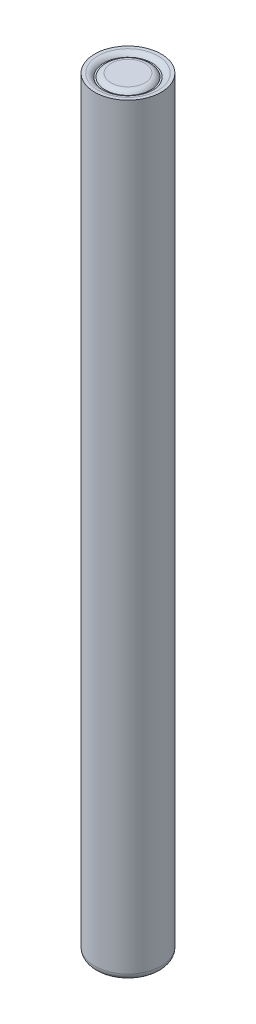
ISO-10303-21;
HEADER;
FILE_DESCRIPTION(('STEP AP214'),'2;1');
FILE_NAME('part.step','',(''),(''),'','','');
FILE_SCHEMA(('AUTOMOTIVE_DESIGN { 1 0 10303 214 1 1 1 1 }'));
ENDSEC;
DATA;
#1=APPLICATION_CONTEXT('core data for automotive mechanical design processes');
#2=APPLICATION_PROTOCOL_DEFINITION('international standard','automotive_design',2000,#1);
#3=PRODUCT_CONTEXT('',#1,'mechanical');
#4=PRODUCT('Part','Part','',(#3));
#5=PRODUCT_RELATED_PRODUCT_CATEGORY('part','',(#4));
#6=PRODUCT_DEFINITION_FORMATION('','',#4);
#7=PRODUCT_DEFINITION_CONTEXT('part definition',#1,'design');
#8=PRODUCT_DEFINITION('design','',#6,#7);
#9=PRODUCT_DEFINITION_SHAPE('','',#8);
#10=(LENGTH_UNIT() NAMED_UNIT(*) SI_UNIT(.MILLI.,.METRE.));
#11=(NAMED_UNIT(*) PLANE_ANGLE_UNIT() SI_UNIT($,.RADIAN.));
#12=(NAMED_UNIT(*) SI_UNIT($,.STERADIAN.) SOLID_ANGLE_UNIT());
#13=UNCERTAINTY_MEASURE_WITH_UNIT(LENGTH_MEASURE(1.E-05),#10,'distance_accuracy_value','');
#14=(GEOMETRIC_REPRESENTATION_CONTEXT(3) GLOBAL_UNCERTAINTY_ASSIGNED_CONTEXT((#13)) GLOBAL_UNIT_ASSIGNED_CONTEXT((#10,
#11,#12)) REPRESENTATION_CONTEXT('',''));
#15=CARTESIAN_POINT('',(0.,0.,0.));
#16=DIRECTION('',(0.,0.,1.));
#17=DIRECTION('',(1.,0.,0.));
#18=AXIS2_PLACEMENT_3D('',#15,#16,#17);
#19=CARTESIAN_POINT('',(0.,115.,0.));
#20=DIRECTION('',(0.,-1.,0.));
#21=DIRECTION('',(0.,0.,-1.));
#22=AXIS2_PLACEMENT_3D('',#19,#20,#21);
#23=CYLINDRICAL_SURFACE('',#22,5.);
#24=CARTESIAN_POINT('',(0.,1.,0.));
#25=DIRECTION('',(0.,1.,0.));
#26=DIRECTION('',(0.,0.,1.));
#27=AXIS2_PLACEMENT_3D('',#24,#25,#26);
#28=CIRCLE('',#27,5.);
#29=CARTESIAN_POINT('',(0.,1.,5.));
#30=VERTEX_POINT('',#29);
#31=EDGE_CURVE('E53',#30,#30,#28,.T.);
#32=ORIENTED_EDGE('',*,*,#31,.T.);
#33=EDGE_LOOP('',(#32));
#34=FACE_BOUND('',#33,.T.);
#35=CARTESIAN_POINT('',(0.,115.,0.));
#36=DIRECTION('',(0.,1.,0.));
#37=DIRECTION('',(0.,0.,1.));
#38=AXIS2_PLACEMENT_3D('',#35,#36,#37);
#39=CIRCLE('',#38,5.);
#40=CARTESIAN_POINT('',(0.,115.,5.));
#41=VERTEX_POINT('',#40);
#42=EDGE_CURVE('E65',#41,#41,#39,.T.);
#43=ORIENTED_EDGE('',*,*,#42,.F.);
#44=EDGE_LOOP('',(#43));
#45=FACE_BOUND('',#44,.T.);
#46=ADVANCED_FACE('F30',(#34,#45),#23,.T.);
#47=CARTESIAN_POINT('',(0.,115.,0.));
#48=DIRECTION('',(0.,1.,0.));
#49=DIRECTION('',(0.,0.,1.));
#50=AXIS2_PLACEMENT_3D('',#47,#48,#49);
#51=PLANE('',#50);
#52=CARTESIAN_POINT('',(0.,115.,0.));
#53=DIRECTION('',(0.,1.,0.));
#54=DIRECTION('',(0.,0.,1.));
#55=AXIS2_PLACEMENT_3D('',#52,#53,#54);
#56=CIRCLE('',#55,4.50328475365712);
#57=CARTESIAN_POINT('',(0.,115.,4.50328475365712));
#58=VERTEX_POINT('',#57);
#59=EDGE_CURVE('E59',#58,#58,#56,.F.);
#60=ORIENTED_EDGE('',*,*,#59,.T.);
#61=EDGE_LOOP('',(#60));
#62=FACE_BOUND('',#61,.T.);
#63=ORIENTED_EDGE('',*,*,#42,.T.);
#64=EDGE_LOOP('',(#63));
#65=FACE_BOUND('',#64,.T.);
#66=ADVANCED_FACE('F101',(#62,#65),#51,.T.);
#67=CARTESIAN_POINT('',(0.,0.,0.));
#68=DIRECTION('',(0.,1.,0.));
#69=DIRECTION('',(0.,0.,1.));
#70=AXIS2_PLACEMENT_3D('',#67,#68,#69);
#71=PLANE('',#70);
#72=CARTESIAN_POINT('',(0.,0.,0.));
#73=DIRECTION('',(0.,1.,0.));
#74=DIRECTION('',(0.,0.,1.));
#75=AXIS2_PLACEMENT_3D('',#72,#73,#74);
#76=CIRCLE('',#75,4.);
#77=CARTESIAN_POINT('',(0.,0.,4.));
#78=VERTEX_POINT('',#77);
#79=EDGE_CURVE('E50',#78,#78,#76,.F.);
#80=ORIENTED_EDGE('',*,*,#79,.T.);
#81=EDGE_LOOP('',(#80));
#82=FACE_BOUND('',#81,.T.);
#83=CARTESIAN_POINT('',(0.,0.,0.));
#84=DIRECTION('',(0.,1.,0.));
#85=DIRECTION('',(0.,0.,1.));
#86=AXIS2_PLACEMENT_3D('',#83,#84,#85);
#87=CIRCLE('',#86,1.5);
#88=CARTESIAN_POINT('',(0.,0.,1.5));
#89=VERTEX_POINT('',#88);
#90=EDGE_CURVE('E62',#89,#89,#87,.F.);
#91=ORIENTED_EDGE('',*,*,#90,.F.);
#92=EDGE_LOOP('',(#91));
#93=FACE_BOUND('',#92,.T.);
#94=ADVANCED_FACE('F109',(#82,#93),#71,.F.);
#95=CARTESIAN_POINT('',(0.,-1.,0.));
#96=DIRECTION('',(0.,1.,0.));
#97=DIRECTION('',(0.,0.,1.));
#98=AXIS2_PLACEMENT_3D('',#95,#96,#97);
#99=CYLINDRICAL_SURFACE('',#98,1.5);
#100=CARTESIAN_POINT('',(0.,-0.45,0.));
#101=DIRECTION('',(0.,-1.,0.));
#102=DIRECTION('',(0.,0.,-1.));
#103=AXIS2_PLACEMENT_3D('',#100,#101,#102);
#104=CIRCLE('',#103,1.5);
#105=CARTESIAN_POINT('',(0.,-0.45,-1.5));
#106=VERTEX_POINT('',#105);
#107=EDGE_CURVE('E41',#106,#106,#104,.F.);
#108=ORIENTED_EDGE('',*,*,#107,.T.);
#109=EDGE_LOOP('',(#108));
#110=FACE_BOUND('',#109,.T.);
#111=ORIENTED_EDGE('',*,*,#90,.T.);
#112=EDGE_LOOP('',(#111));
#113=FACE_BOUND('',#112,.T.);
#114=ADVANCED_FACE('F114',(#110,#113),#99,.T.);
#115=CARTESIAN_POINT('',(0.,-1.,0.));
#116=DIRECTION('',(0.,-1.,0.));
#117=DIRECTION('',(0.,0.,-1.));
#118=AXIS2_PLACEMENT_3D('',#115,#116,#117);
#119=PLANE('',#118);
#120=CARTESIAN_POINT('',(0.,-1.,0.));
#121=DIRECTION('',(0.,-1.,0.));
#122=DIRECTION('',(0.,0.,-1.));
#123=AXIS2_PLACEMENT_3D('',#120,#121,#122);
#124=CIRCLE('',#123,0.95);
#125=CARTESIAN_POINT('',(0.,-1.,-0.95));
#126=VERTEX_POINT('',#125);
#127=EDGE_CURVE('E45',#126,#126,#124,.T.);
#128=ORIENTED_EDGE('',*,*,#127,.T.);
#129=EDGE_LOOP('',(#128));
#130=FACE_BOUND('',#129,.T.);
#131=CARTESIAN_POINT('',(0.,-1.,0.));
#132=DIRECTION('',(0.,-1.,0.));
#133=DIRECTION('',(0.,0.,-1.));
#134=AXIS2_PLACEMENT_3D('',#131,#132,#133);
#135=CIRCLE('',#134,0.5);
#136=CARTESIAN_POINT('',(0.,-1.,-0.5));
#137=VERTEX_POINT('',#136);
#138=EDGE_CURVE('E68',#137,#137,#135,.T.);
#139=ORIENTED_EDGE('',*,*,#138,.F.);
#140=EDGE_LOOP('',(#139));
#141=FACE_BOUND('',#140,.T.);
#142=ADVANCED_FACE('F119',(#130,#141),#119,.T.);
#143=CARTESIAN_POINT('',(0.,-1.5,0.));
#144=DIRECTION('',(0.,1.,0.));
#145=DIRECTION('',(0.,0.,1.));
#146=AXIS2_PLACEMENT_3D('',#143,#144,#145);
#147=CYLINDRICAL_SURFACE('',#146,0.5);
#148=CARTESIAN_POINT('',(0.,-1.4,0.));
#149=DIRECTION('',(0.,-1.,0.));
#150=DIRECTION('',(0.,0.,-1.));
#151=AXIS2_PLACEMENT_3D('',#148,#149,#150);
#152=CIRCLE('',#151,0.5);
#153=CARTESIAN_POINT('',(0.,-1.4,-0.5));
#154=VERTEX_POINT('',#153);
#155=EDGE_CURVE('E10',#154,#154,#152,.F.);
#156=ORIENTED_EDGE('',*,*,#155,.T.);
#157=EDGE_LOOP('',(#156));
#158=FACE_BOUND('',#157,.T.);
#159=ORIENTED_EDGE('',*,*,#138,.T.);
#160=EDGE_LOOP('',(#159));
#161=FACE_BOUND('',#160,.T.);
#162=ADVANCED_FACE('F123',(#158,#161),#147,.T.);
#163=CARTESIAN_POINT('',(0.,-1.5,0.));
#164=DIRECTION('',(0.,-1.,0.));
#165=DIRECTION('',(0.,0.,-1.));
#166=AXIS2_PLACEMENT_3D('',#163,#164,#165);
#167=PLANE('',#166);
#168=CARTESIAN_POINT('',(0.,-1.5,0.));
#169=DIRECTION('',(0.,-1.,0.));
#170=DIRECTION('',(0.,0.,-1.));
#171=AXIS2_PLACEMENT_3D('',#168,#169,#170);
#172=CIRCLE('',#171,0.4);
#173=CARTESIAN_POINT('',(0.,-1.5,-0.4));
#174=VERTEX_POINT('',#173);
#175=EDGE_CURVE('E37',#174,#174,#172,.T.);
#176=ORIENTED_EDGE('',*,*,#175,.T.);
#177=EDGE_LOOP('',(#176));
#178=FACE_BOUND('',#177,.T.);
#179=ADVANCED_FACE('F85',(#178),#167,.T.);
#180=CARTESIAN_POINT('',(0.,114.5,0.));
#181=DIRECTION('',(0.,1.,0.));
#182=DIRECTION('',(0.,0.,1.));
#183=AXIS2_PLACEMENT_3D('',#180,#181,#182);
#184=PLANE('',#183);
#185=CARTESIAN_POINT('',(0.,114.5,0.));
#186=DIRECTION('',(0.,1.,0.));
#187=DIRECTION('',(0.,0.,1.));
#188=AXIS2_PLACEMENT_3D('',#185,#186,#187);
#189=CIRCLE('',#188,3.41192903444036);
#190=CARTESIAN_POINT('',(0.,114.5,3.41192903444036));
#191=VERTEX_POINT('',#190);
#192=EDGE_CURVE('E74',#191,#191,#189,.T.);
#193=ORIENTED_EDGE('',*,*,#192,.F.);
#194=EDGE_LOOP('',(#193));
#195=FACE_BOUND('',#194,.T.);
#196=CARTESIAN_POINT('',(0.,114.5,0.));
#197=DIRECTION('',(0.,1.,0.));
#198=DIRECTION('',(0.,0.,1.));
#199=AXIS2_PLACEMENT_3D('',#196,#197,#198);
#200=CIRCLE('',#199,3.63725934987268);
#201=CARTESIAN_POINT('',(0.,114.5,3.63725934987268));
#202=VERTEX_POINT('',#201);
#203=EDGE_CURVE('E71',#202,#202,#200,.T.);
#204=ORIENTED_EDGE('',*,*,#203,.T.);
#205=EDGE_LOOP('',(#204));
#206=FACE_BOUND('',#205,.T.);
#207=ADVANCED_FACE('F81',(#195,#206),#184,.T.);
#208=CARTESIAN_POINT('',(0.,115.,0.));
#209=DIRECTION('',(0.,1.,0.));
#210=DIRECTION('',(0.,0.,1.));
#211=AXIS2_PLACEMENT_3D('',#208,#209,#210);
#212=CIRCLE('',#211,2.54590363065592);
#213=CARTESIAN_POINT('',(0.,115.,2.54590363065592));
#214=VERTEX_POINT('',#213);
#215=EDGE_CURVE('E56',#214,#214,#212,.T.);
#216=ORIENTED_EDGE('',*,*,#215,.T.);
#217=EDGE_LOOP('',(#216));
#218=FACE_BOUND('',#217,.T.);
#219=ADVANCED_FACE('F84',(#218),#51,.T.);
#220=CARTESIAN_POINT('',(0.,114.,0.));
#221=DIRECTION('',(0.,1.,0.));
#222=DIRECTION('',(0.,0.,1.));
#223=AXIS2_PLACEMENT_3D('',#220,#221,#222);
#224=TOROIDAL_SURFACE('',#223,4.50328475365712,1.);
#225=ORIENTED_EDGE('',*,*,#59,.F.);
#226=EDGE_LOOP('',(#225));
#227=FACE_BOUND('',#226,.T.);
#228=ORIENTED_EDGE('',*,*,#203,.F.);
#229=EDGE_LOOP('',(#228));
#230=FACE_BOUND('',#229,.T.);
#231=ADVANCED_FACE('F89',(#227,#230),#224,.T.);
#232=CARTESIAN_POINT('',(0.,114.,0.));
#233=DIRECTION('',(0.,-1.,0.));
#234=DIRECTION('',(0.,0.,-1.));
#235=AXIS2_PLACEMENT_3D('',#232,#233,#234);
#236=TOROIDAL_SURFACE('',#235,2.54590363065592,1.);
#237=ORIENTED_EDGE('',*,*,#192,.T.);
#238=EDGE_LOOP('',(#237));
#239=FACE_BOUND('',#238,.T.);
#240=ORIENTED_EDGE('',*,*,#215,.F.);
#241=EDGE_LOOP('',(#240));
#242=FACE_BOUND('',#241,.T.);
#243=ADVANCED_FACE('F78',(#239,#242),#236,.T.);
#244=CARTESIAN_POINT('',(0.,1.,0.));
#245=DIRECTION('',(0.,1.,0.));
#246=DIRECTION('',(0.,0.,1.));
#247=AXIS2_PLACEMENT_3D('',#244,#245,#246);
#248=TOROIDAL_SURFACE('',#247,4.,1.);
#249=ORIENTED_EDGE('',*,*,#79,.F.);
#250=EDGE_LOOP('',(#249));
#251=FACE_BOUND('',#250,.T.);
#252=ORIENTED_EDGE('',*,*,#31,.F.);
#253=EDGE_LOOP('',(#252));
#254=FACE_BOUND('',#253,.T.);
#255=ADVANCED_FACE('F97',(#251,#254),#248,.T.);
#256=CARTESIAN_POINT('',(0.,-0.45,0.));
#257=DIRECTION('',(0.,-1.,0.));
#258=DIRECTION('',(0.,0.,-1.));
#259=AXIS2_PLACEMENT_3D('',#256,#257,#258);
#260=TOROIDAL_SURFACE('',#259,0.95,0.55);
#261=ORIENTED_EDGE('',*,*,#107,.F.);
#262=EDGE_LOOP('',(#261));
#263=FACE_BOUND('',#262,.T.);
#264=ORIENTED_EDGE('',*,*,#127,.F.);
#265=EDGE_LOOP('',(#264));
#266=FACE_BOUND('',#265,.T.);
#267=ADVANCED_FACE('F174',(#263,#266),#260,.T.);
#268=CARTESIAN_POINT('',(0.,-1.4,0.));
#269=DIRECTION('',(0.,-1.,0.));
#270=DIRECTION('',(0.,0.,-1.));
#271=AXIS2_PLACEMENT_3D('',#268,#269,#270);
#272=TOROIDAL_SURFACE('',#271,0.4,0.1);
#273=ORIENTED_EDGE('',*,*,#155,.F.);
#274=EDGE_LOOP('',(#273));
#275=FACE_BOUND('',#274,.T.);
#276=ORIENTED_EDGE('',*,*,#175,.F.);
#277=EDGE_LOOP('',(#276));
#278=FACE_BOUND('',#277,.T.);
#279=ADVANCED_FACE('F32',(#275,#278),#272,.T.);
#280=CLOSED_SHELL('',(#46,#66,#94,#114,#142,#162,#179,#207,#219,#231,#243,#255,#267,#279));
#281=MANIFOLD_SOLID_BREP('B2',#280);
#282=ADVANCED_BREP_SHAPE_REPRESENTATION('',(#18,#281),#14);
#283=SHAPE_DEFINITION_REPRESENTATION(#9,#282);
ENDSEC;
END-ISO-10303-21;
